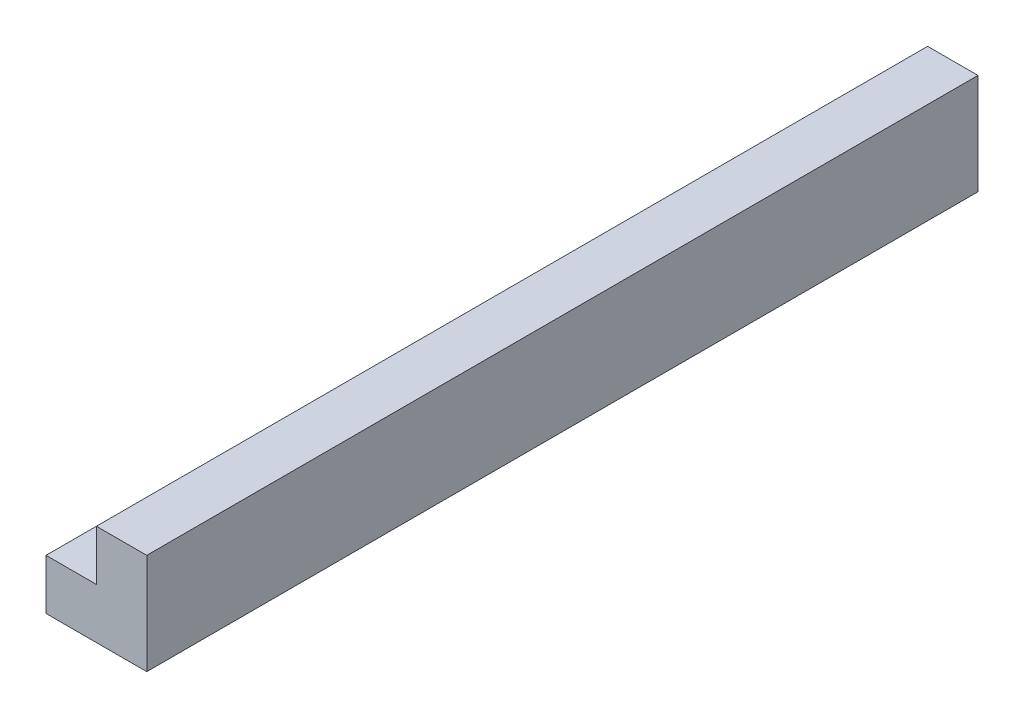
ISO-10303-21;
HEADER;
FILE_DESCRIPTION(('STEP AP214'),'2;1');
FILE_NAME('part.step','',(''),(''),'','','');
FILE_SCHEMA(('AUTOMOTIVE_DESIGN { 1 0 10303 214 1 1 1 1 }'));
ENDSEC;
DATA;
#1=APPLICATION_CONTEXT('core data for automotive mechanical design processes');
#2=APPLICATION_PROTOCOL_DEFINITION('international standard','automotive_design',2000,#1);
#3=PRODUCT_CONTEXT('',#1,'mechanical');
#4=PRODUCT('Part','Part','',(#3));
#5=PRODUCT_RELATED_PRODUCT_CATEGORY('part','',(#4));
#6=PRODUCT_DEFINITION_FORMATION('','',#4);
#7=PRODUCT_DEFINITION_CONTEXT('part definition',#1,'design');
#8=PRODUCT_DEFINITION('design','',#6,#7);
#9=PRODUCT_DEFINITION_SHAPE('','',#8);
#10=(LENGTH_UNIT() NAMED_UNIT(*) SI_UNIT(.MILLI.,.METRE.));
#11=(NAMED_UNIT(*) PLANE_ANGLE_UNIT() SI_UNIT($,.RADIAN.));
#12=(NAMED_UNIT(*) SI_UNIT($,.STERADIAN.) SOLID_ANGLE_UNIT());
#13=UNCERTAINTY_MEASURE_WITH_UNIT(LENGTH_MEASURE(1.E-05),#10,'distance_accuracy_value','');
#14=(GEOMETRIC_REPRESENTATION_CONTEXT(3) GLOBAL_UNCERTAINTY_ASSIGNED_CONTEXT((#13)) GLOBAL_UNIT_ASSIGNED_CONTEXT((#10,
#11,#12)) REPRESENTATION_CONTEXT('',''));
#15=CARTESIAN_POINT('',(0.,0.,0.));
#16=DIRECTION('',(0.,0.,1.));
#17=DIRECTION('',(1.,0.,0.));
#18=AXIS2_PLACEMENT_3D('',#15,#16,#17);
#19=CARTESIAN_POINT('',(0.,10.,165.));
#20=DIRECTION('',(1.,0.,0.));
#21=DIRECTION('',(0.,0.,-1.));
#22=AXIS2_PLACEMENT_3D('',#19,#20,#21);
#23=PLANE('',#22);
#24=DIRECTION('',(0.,-1.,0.));
#25=VECTOR('',#24,1.);
#26=CARTESIAN_POINT('',(0.,10.,0.));
#27=LINE('',#26,#25);
#28=CARTESIAN_POINT('',(0.,10.,0.));
#29=VERTEX_POINT('',#28);
#30=CARTESIAN_POINT('',(0.,0.,0.));
#31=VERTEX_POINT('',#30);
#32=EDGE_CURVE('E121',#29,#31,#27,.T.);
#33=ORIENTED_EDGE('',*,*,#32,.T.);
#34=DIRECTION('',(0.,0.,-1.));
#35=VECTOR('',#34,1.);
#36=CARTESIAN_POINT('',(0.,0.,165.));
#37=LINE('',#36,#35);
#38=CARTESIAN_POINT('',(0.,0.,165.));
#39=VERTEX_POINT('',#38);
#40=EDGE_CURVE('E11',#39,#31,#37,.T.);
#41=ORIENTED_EDGE('',*,*,#40,.F.);
#42=DIRECTION('',(0.,-1.,0.));
#43=VECTOR('',#42,1.);
#44=CARTESIAN_POINT('',(0.,10.,165.));
#45=LINE('',#44,#43);
#46=CARTESIAN_POINT('',(0.,10.,165.));
#47=VERTEX_POINT('',#46);
#48=EDGE_CURVE('E131',#47,#39,#45,.T.);
#49=ORIENTED_EDGE('',*,*,#48,.F.);
#50=DIRECTION('',(0.,0.,-1.));
#51=VECTOR('',#50,1.);
#52=CARTESIAN_POINT('',(0.,10.,165.));
#53=LINE('',#52,#51);
#54=EDGE_CURVE('E117',#47,#29,#53,.T.);
#55=ORIENTED_EDGE('',*,*,#54,.T.);
#56=EDGE_LOOP('',(#33,#41,#49,#55));
#57=FACE_BOUND('',#56,.T.);
#58=ADVANCED_FACE('F37',(#57),#23,.F.);
#59=CARTESIAN_POINT('',(0.,0.,165.));
#60=DIRECTION('',(0.,1.,0.));
#61=DIRECTION('',(0.,0.,1.));
#62=AXIS2_PLACEMENT_3D('',#59,#60,#61);
#63=PLANE('',#62);
#64=DIRECTION('',(1.,0.,0.));
#65=VECTOR('',#64,1.);
#66=CARTESIAN_POINT('',(0.,0.,0.));
#67=LINE('',#66,#65);
#68=CARTESIAN_POINT('',(20.,0.,0.));
#69=VERTEX_POINT('',#68);
#70=EDGE_CURVE('E124',#31,#69,#67,.T.);
#71=ORIENTED_EDGE('',*,*,#70,.T.);
#72=DIRECTION('',(0.,0.,-1.));
#73=VECTOR('',#72,1.);
#74=CARTESIAN_POINT('',(20.,0.,165.));
#75=LINE('',#74,#73);
#76=CARTESIAN_POINT('',(20.,0.,165.));
#77=VERTEX_POINT('',#76);
#78=EDGE_CURVE('E45',#77,#69,#75,.T.);
#79=ORIENTED_EDGE('',*,*,#78,.F.);
#80=DIRECTION('',(1.,0.,0.));
#81=VECTOR('',#80,1.);
#82=CARTESIAN_POINT('',(0.,0.,165.));
#83=LINE('',#82,#81);
#84=EDGE_CURVE('E90',#39,#77,#83,.T.);
#85=ORIENTED_EDGE('',*,*,#84,.F.);
#86=ORIENTED_EDGE('',*,*,#40,.T.);
#87=EDGE_LOOP('',(#71,#79,#85,#86));
#88=FACE_BOUND('',#87,.T.);
#89=ADVANCED_FACE('F155',(#88),#63,.F.);
#90=CARTESIAN_POINT('',(20.,0.,165.));
#91=DIRECTION('',(-1.,0.,0.));
#92=DIRECTION('',(0.,0.,1.));
#93=AXIS2_PLACEMENT_3D('',#90,#91,#92);
#94=PLANE('',#93);
#95=DIRECTION('',(0.,1.,0.));
#96=VECTOR('',#95,1.);
#97=CARTESIAN_POINT('',(20.,0.,0.));
#98=LINE('',#97,#96);
#99=CARTESIAN_POINT('',(20.,20.,0.));
#100=VERTEX_POINT('',#99);
#101=EDGE_CURVE('E126',#69,#100,#98,.T.);
#102=ORIENTED_EDGE('',*,*,#101,.T.);
#103=DIRECTION('',(0.,0.,-1.));
#104=VECTOR('',#103,1.);
#105=CARTESIAN_POINT('',(20.,20.,165.));
#106=LINE('',#105,#104);
#107=CARTESIAN_POINT('',(20.,20.,165.));
#108=VERTEX_POINT('',#107);
#109=EDGE_CURVE('E112',#108,#100,#106,.T.);
#110=ORIENTED_EDGE('',*,*,#109,.F.);
#111=DIRECTION('',(0.,1.,0.));
#112=VECTOR('',#111,1.);
#113=CARTESIAN_POINT('',(20.,0.,165.));
#114=LINE('',#113,#112);
#115=EDGE_CURVE('E103',#77,#108,#114,.T.);
#116=ORIENTED_EDGE('',*,*,#115,.F.);
#117=ORIENTED_EDGE('',*,*,#78,.T.);
#118=EDGE_LOOP('',(#102,#110,#116,#117));
#119=FACE_BOUND('',#118,.T.);
#120=ADVANCED_FACE('F137',(#119),#94,.F.);
#121=CARTESIAN_POINT('',(20.,20.,165.));
#122=DIRECTION('',(0.,-1.,0.));
#123=DIRECTION('',(0.,0.,-1.));
#124=AXIS2_PLACEMENT_3D('',#121,#122,#123);
#125=PLANE('',#124);
#126=DIRECTION('',(-1.,0.,0.));
#127=VECTOR('',#126,1.);
#128=CARTESIAN_POINT('',(20.,20.,0.));
#129=LINE('',#128,#127);
#130=CARTESIAN_POINT('',(10.,20.,0.));
#131=VERTEX_POINT('',#130);
#132=EDGE_CURVE('E111',#100,#131,#129,.T.);
#133=ORIENTED_EDGE('',*,*,#132,.T.);
#134=DIRECTION('',(0.,0.,-1.));
#135=VECTOR('',#134,1.);
#136=CARTESIAN_POINT('',(10.,20.,165.));
#137=LINE('',#136,#135);
#138=CARTESIAN_POINT('',(10.,20.,165.));
#139=VERTEX_POINT('',#138);
#140=EDGE_CURVE('E108',#139,#131,#137,.T.);
#141=ORIENTED_EDGE('',*,*,#140,.F.);
#142=DIRECTION('',(-1.,0.,0.));
#143=VECTOR('',#142,1.);
#144=CARTESIAN_POINT('',(20.,20.,165.));
#145=LINE('',#144,#143);
#146=EDGE_CURVE('E97',#108,#139,#145,.T.);
#147=ORIENTED_EDGE('',*,*,#146,.F.);
#148=ORIENTED_EDGE('',*,*,#109,.T.);
#149=EDGE_LOOP('',(#133,#141,#147,#148));
#150=FACE_BOUND('',#149,.T.);
#151=ADVANCED_FACE('F109',(#150),#125,.F.);
#152=CARTESIAN_POINT('',(10.,20.,165.));
#153=DIRECTION('',(1.,0.,0.));
#154=DIRECTION('',(0.,0.,-1.));
#155=AXIS2_PLACEMENT_3D('',#152,#153,#154);
#156=PLANE('',#155);
#157=DIRECTION('',(0.,-1.,0.));
#158=VECTOR('',#157,1.);
#159=CARTESIAN_POINT('',(10.,20.,0.));
#160=LINE('',#159,#158);
#161=CARTESIAN_POINT('',(10.,10.,0.));
#162=VERTEX_POINT('',#161);
#163=EDGE_CURVE('E76',#131,#162,#160,.T.);
#164=ORIENTED_EDGE('',*,*,#163,.T.);
#165=DIRECTION('',(0.,0.,-1.));
#166=VECTOR('',#165,1.);
#167=CARTESIAN_POINT('',(10.,10.,165.));
#168=LINE('',#167,#166);
#169=CARTESIAN_POINT('',(10.,10.,165.));
#170=VERTEX_POINT('',#169);
#171=EDGE_CURVE('E113',#170,#162,#168,.T.);
#172=ORIENTED_EDGE('',*,*,#171,.F.);
#173=DIRECTION('',(0.,-1.,0.));
#174=VECTOR('',#173,1.);
#175=CARTESIAN_POINT('',(10.,20.,165.));
#176=LINE('',#175,#174);
#177=EDGE_CURVE('E101',#139,#170,#176,.T.);
#178=ORIENTED_EDGE('',*,*,#177,.F.);
#179=ORIENTED_EDGE('',*,*,#140,.T.);
#180=EDGE_LOOP('',(#164,#172,#178,#179));
#181=FACE_BOUND('',#180,.T.);
#182=ADVANCED_FACE('F115',(#181),#156,.F.);
#183=CARTESIAN_POINT('',(10.,10.,165.));
#184=DIRECTION('',(0.,-1.,0.));
#185=DIRECTION('',(0.,0.,-1.));
#186=AXIS2_PLACEMENT_3D('',#183,#184,#185);
#187=PLANE('',#186);
#188=DIRECTION('',(-1.,0.,0.));
#189=VECTOR('',#188,1.);
#190=CARTESIAN_POINT('',(10.,10.,0.));
#191=LINE('',#190,#189);
#192=EDGE_CURVE('E82',#162,#29,#191,.T.);
#193=ORIENTED_EDGE('',*,*,#192,.T.);
#194=ORIENTED_EDGE('',*,*,#54,.F.);
#195=DIRECTION('',(-1.,0.,0.));
#196=VECTOR('',#195,1.);
#197=CARTESIAN_POINT('',(10.,10.,165.));
#198=LINE('',#197,#196);
#199=EDGE_CURVE('E53',#170,#47,#198,.T.);
#200=ORIENTED_EDGE('',*,*,#199,.F.);
#201=ORIENTED_EDGE('',*,*,#171,.T.);
#202=EDGE_LOOP('',(#193,#194,#200,#201));
#203=FACE_BOUND('',#202,.T.);
#204=ADVANCED_FACE('F144',(#203),#187,.F.);
#205=CARTESIAN_POINT('',(0.,0.,165.));
#206=DIRECTION('',(0.,0.,1.));
#207=DIRECTION('',(1.,0.,0.));
#208=AXIS2_PLACEMENT_3D('',#205,#206,#207);
#209=PLANE('',#208);
#210=ORIENTED_EDGE('',*,*,#48,.T.);
#211=ORIENTED_EDGE('',*,*,#84,.T.);
#212=ORIENTED_EDGE('',*,*,#115,.T.);
#213=ORIENTED_EDGE('',*,*,#146,.T.);
#214=ORIENTED_EDGE('',*,*,#177,.T.);
#215=ORIENTED_EDGE('',*,*,#199,.T.);
#216=EDGE_LOOP('',(#210,#211,#212,#213,#214,#215));
#217=FACE_BOUND('',#216,.T.);
#218=ADVANCED_FACE('F99',(#217),#209,.T.);
#219=CARTESIAN_POINT('',(0.,0.,0.));
#220=DIRECTION('',(0.,0.,1.));
#221=DIRECTION('',(1.,0.,0.));
#222=AXIS2_PLACEMENT_3D('',#219,#220,#221);
#223=PLANE('',#222);
#224=ORIENTED_EDGE('',*,*,#32,.F.);
#225=ORIENTED_EDGE('',*,*,#192,.F.);
#226=ORIENTED_EDGE('',*,*,#163,.F.);
#227=ORIENTED_EDGE('',*,*,#132,.F.);
#228=ORIENTED_EDGE('',*,*,#101,.F.);
#229=ORIENTED_EDGE('',*,*,#70,.F.);
#230=EDGE_LOOP('',(#224,#225,#226,#227,#228,#229));
#231=FACE_BOUND('',#230,.T.);
#232=ADVANCED_FACE('F140',(#231),#223,.F.);
#233=CLOSED_SHELL('',(#58,#89,#120,#151,#182,#204,#218,#232));
#234=MANIFOLD_SOLID_BREP('B2',#233);
#235=ADVANCED_BREP_SHAPE_REPRESENTATION('',(#18,#234),#14);
#236=SHAPE_DEFINITION_REPRESENTATION(#9,#235);
ENDSEC;
END-ISO-10303-21;
